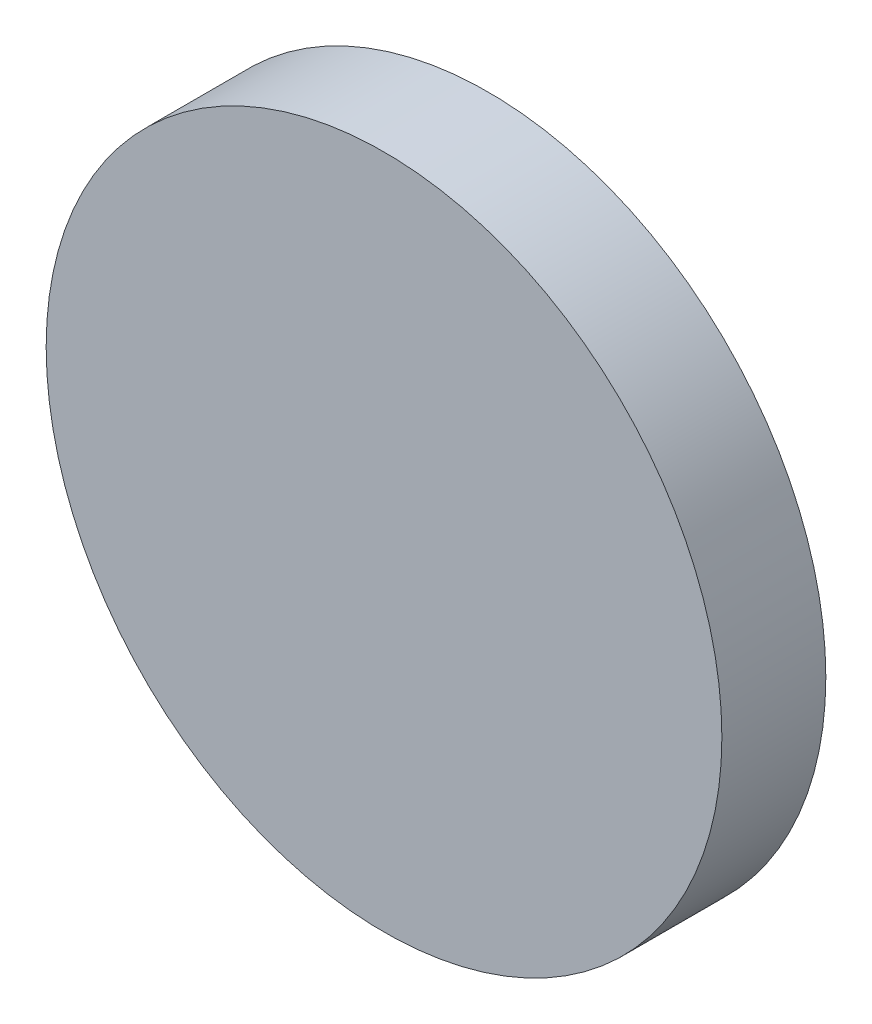
ISO-10303-21;
HEADER;
FILE_DESCRIPTION(('STEP AP214'),'2;1');
FILE_NAME('part.step','',(''),(''),'','','');
FILE_SCHEMA(('AUTOMOTIVE_DESIGN { 1 0 10303 214 1 1 1 1 }'));
ENDSEC;
DATA;
#1=APPLICATION_CONTEXT('core data for automotive mechanical design processes');
#2=APPLICATION_PROTOCOL_DEFINITION('international standard','automotive_design',2000,#1);
#3=PRODUCT_CONTEXT('',#1,'mechanical');
#4=PRODUCT('Part','Part','',(#3));
#5=PRODUCT_RELATED_PRODUCT_CATEGORY('part','',(#4));
#6=PRODUCT_DEFINITION_FORMATION('','',#4);
#7=PRODUCT_DEFINITION_CONTEXT('part definition',#1,'design');
#8=PRODUCT_DEFINITION('design','',#6,#7);
#9=PRODUCT_DEFINITION_SHAPE('','',#8);
#10=(LENGTH_UNIT() NAMED_UNIT(*) SI_UNIT(.MILLI.,.METRE.));
#11=(NAMED_UNIT(*) PLANE_ANGLE_UNIT() SI_UNIT($,.RADIAN.));
#12=(NAMED_UNIT(*) SI_UNIT($,.STERADIAN.) SOLID_ANGLE_UNIT());
#13=UNCERTAINTY_MEASURE_WITH_UNIT(LENGTH_MEASURE(1.E-05),#10,'distance_accuracy_value','');
#14=(GEOMETRIC_REPRESENTATION_CONTEXT(3) GLOBAL_UNCERTAINTY_ASSIGNED_CONTEXT((#13)) GLOBAL_UNIT_ASSIGNED_CONTEXT((#10,
#11,#12)) REPRESENTATION_CONTEXT('',''));
#15=CARTESIAN_POINT('',(0.,0.,0.));
#16=DIRECTION('',(0.,0.,1.));
#17=DIRECTION('',(1.,0.,0.));
#18=AXIS2_PLACEMENT_3D('',#15,#16,#17);
#19=CARTESIAN_POINT('',(0.,0.,1.));
#20=DIRECTION('',(0.,0.,-1.));
#21=DIRECTION('',(-1.,0.,0.));
#22=AXIS2_PLACEMENT_3D('',#19,#20,#21);
#23=CYLINDRICAL_SURFACE('',#22,3.25);
#24=CARTESIAN_POINT('',(0.,0.,1.));
#25=DIRECTION('',(0.,0.,1.));
#26=DIRECTION('',(1.,0.,0.));
#27=AXIS2_PLACEMENT_3D('',#24,#25,#26);
#28=CIRCLE('',#27,3.25);
#29=CARTESIAN_POINT('',(3.25,0.,1.));
#30=VERTEX_POINT('',#29);
#31=EDGE_CURVE('E10',#30,#30,#28,.T.);
#32=ORIENTED_EDGE('',*,*,#31,.F.);
#33=EDGE_LOOP('',(#32));
#34=FACE_BOUND('',#33,.T.);
#35=CARTESIAN_POINT('',(0.,0.,0.));
#36=DIRECTION('',(0.,0.,1.));
#37=DIRECTION('',(1.,0.,0.));
#38=AXIS2_PLACEMENT_3D('',#35,#36,#37);
#39=CIRCLE('',#38,3.25);
#40=CARTESIAN_POINT('',(3.25,0.,0.));
#41=VERTEX_POINT('',#40);
#42=EDGE_CURVE('E35',#41,#41,#39,.T.);
#43=ORIENTED_EDGE('',*,*,#42,.T.);
#44=EDGE_LOOP('',(#43));
#45=FACE_BOUND('',#44,.T.);
#46=ADVANCED_FACE('F32',(#34,#45),#23,.T.);
#47=CARTESIAN_POINT('',(0.,0.,1.));
#48=DIRECTION('',(0.,0.,1.));
#49=DIRECTION('',(1.,0.,0.));
#50=AXIS2_PLACEMENT_3D('',#47,#48,#49);
#51=PLANE('',#50);
#52=ORIENTED_EDGE('',*,*,#31,.T.);
#53=EDGE_LOOP('',(#52));
#54=FACE_BOUND('',#53,.T.);
#55=ADVANCED_FACE('F47',(#54),#51,.T.);
#56=CARTESIAN_POINT('',(0.,0.,0.));
#57=DIRECTION('',(0.,0.,1.));
#58=DIRECTION('',(1.,0.,0.));
#59=AXIS2_PLACEMENT_3D('',#56,#57,#58);
#60=PLANE('',#59);
#61=ORIENTED_EDGE('',*,*,#42,.F.);
#62=EDGE_LOOP('',(#61));
#63=FACE_BOUND('',#62,.T.);
#64=ADVANCED_FACE('F45',(#63),#60,.F.);
#65=CLOSED_SHELL('',(#46,#55,#64));
#66=MANIFOLD_SOLID_BREP('B2',#65);
#67=ADVANCED_BREP_SHAPE_REPRESENTATION('',(#18,#66),#14);
#68=SHAPE_DEFINITION_REPRESENTATION(#9,#67);
ENDSEC;
END-ISO-10303-21;
